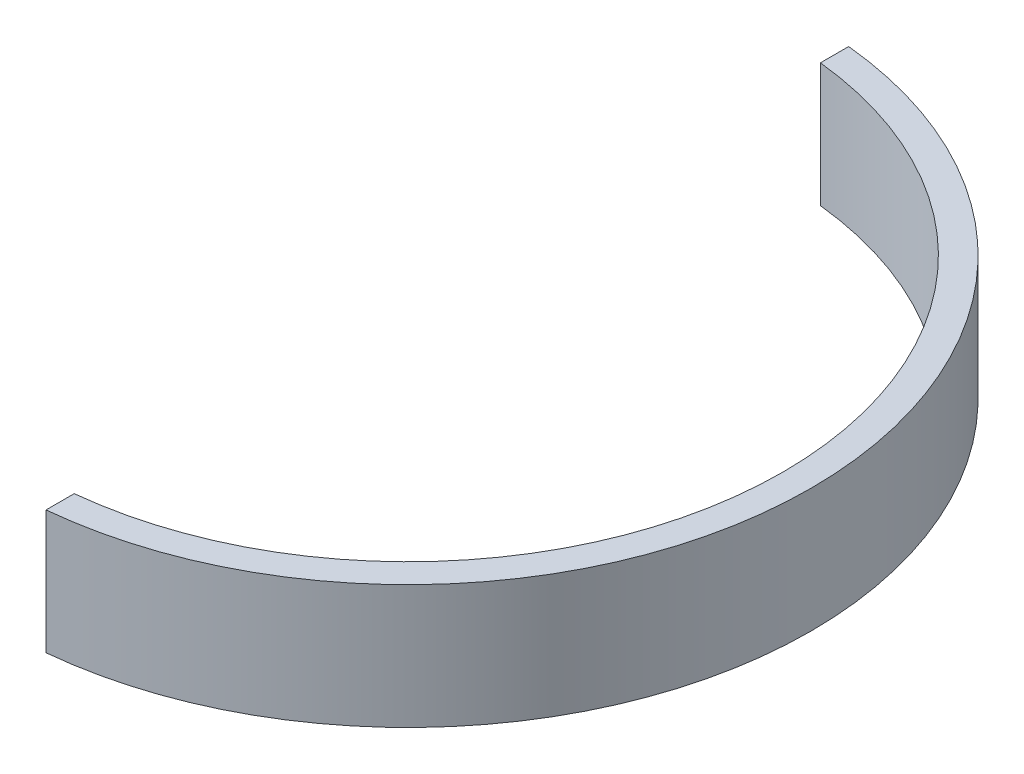
ISO-10303-21;
HEADER;
FILE_DESCRIPTION(('STEP AP214'),'2;1');
FILE_NAME('part.step','',(''),(''),'','','');
FILE_SCHEMA(('AUTOMOTIVE_DESIGN { 1 0 10303 214 1 1 1 1 }'));
ENDSEC;
DATA;
#1=APPLICATION_CONTEXT('core data for automotive mechanical design processes');
#2=APPLICATION_PROTOCOL_DEFINITION('international standard','automotive_design',2000,#1);
#3=PRODUCT_CONTEXT('',#1,'mechanical');
#4=PRODUCT('Part','Part','',(#3));
#5=PRODUCT_RELATED_PRODUCT_CATEGORY('part','',(#4));
#6=PRODUCT_DEFINITION_FORMATION('','',#4);
#7=PRODUCT_DEFINITION_CONTEXT('part definition',#1,'design');
#8=PRODUCT_DEFINITION('design','',#6,#7);
#9=PRODUCT_DEFINITION_SHAPE('','',#8);
#10=(LENGTH_UNIT() NAMED_UNIT(*) SI_UNIT(.MILLI.,.METRE.));
#11=(NAMED_UNIT(*) PLANE_ANGLE_UNIT() SI_UNIT($,.RADIAN.));
#12=(NAMED_UNIT(*) SI_UNIT($,.STERADIAN.) SOLID_ANGLE_UNIT());
#13=UNCERTAINTY_MEASURE_WITH_UNIT(LENGTH_MEASURE(1.E-05),#10,'distance_accuracy_value','');
#14=(GEOMETRIC_REPRESENTATION_CONTEXT(3) GLOBAL_UNCERTAINTY_ASSIGNED_CONTEXT((#13)) GLOBAL_UNIT_ASSIGNED_CONTEXT((#10,
#11,#12)) REPRESENTATION_CONTEXT('',''));
#15=CARTESIAN_POINT('',(0.,0.,0.));
#16=DIRECTION('',(0.,0.,1.));
#17=DIRECTION('',(1.,0.,0.));
#18=AXIS2_PLACEMENT_3D('',#15,#16,#17);
#19=CARTESIAN_POINT('',(0.,22.04,0.));
#20=DIRECTION('',(0.,-1.,0.));
#21=DIRECTION('',(0.,0.,-1.));
#22=AXIS2_PLACEMENT_3D('',#19,#20,#21);
#23=CYLINDRICAL_SURFACE('',#22,66.845);
#24=CARTESIAN_POINT('',(0.,0.,0.));
#25=DIRECTION('',(0.,-1.,0.));
#26=DIRECTION('',(0.,0.,1.));
#27=AXIS2_PLACEMENT_3D('',#24,#25,#26);
#28=CIRCLE('',#27,66.845);
#29=CARTESIAN_POINT('',(7.03599999999999,0.,-66.473669441366));
#30=VERTEX_POINT('',#29);
#31=CARTESIAN_POINT('',(7.03599999999999,0.,66.473669441366));
#32=VERTEX_POINT('',#31);
#33=EDGE_CURVE('E96',#30,#32,#28,.T.);
#34=ORIENTED_EDGE('',*,*,#33,.T.);
#35=DIRECTION('',(0.,-1.,0.));
#36=VECTOR('',#35,1.);
#37=CARTESIAN_POINT('',(7.03599999999999,22.04,66.473669441366));
#38=LINE('',#37,#36);
#39=CARTESIAN_POINT('',(7.03599999999999,22.04,66.473669441366));
#40=VERTEX_POINT('',#39);
#41=EDGE_CURVE('E11',#40,#32,#38,.T.);
#42=ORIENTED_EDGE('',*,*,#41,.F.);
#43=CARTESIAN_POINT('',(0.,22.04,0.));
#44=DIRECTION('',(0.,-1.,0.));
#45=DIRECTION('',(0.,0.,1.));
#46=AXIS2_PLACEMENT_3D('',#43,#44,#45);
#47=CIRCLE('',#46,66.845);
#48=CARTESIAN_POINT('',(7.03599999999999,22.04,-66.473669441366));
#49=VERTEX_POINT('',#48);
#50=EDGE_CURVE('E84',#49,#40,#47,.T.);
#51=ORIENTED_EDGE('',*,*,#50,.F.);
#52=DIRECTION('',(0.,-1.,0.));
#53=VECTOR('',#52,1.);
#54=CARTESIAN_POINT('',(7.03599999999999,22.04,-66.473669441366));
#55=LINE('',#54,#53);
#56=EDGE_CURVE('E92',#49,#30,#55,.T.);
#57=ORIENTED_EDGE('',*,*,#56,.T.);
#58=EDGE_LOOP('',(#34,#42,#51,#57));
#59=FACE_BOUND('',#58,.T.);
#60=ADVANCED_FACE('F33',(#59),#23,.F.);
#61=CARTESIAN_POINT('',(7.03599999999999,22.04,66.473669441366));
#62=DIRECTION('',(1.,0.,0.));
#63=DIRECTION('',(0.,0.,-1.));
#64=AXIS2_PLACEMENT_3D('',#61,#62,#63);
#65=PLANE('',#64);
#66=DIRECTION('',(0.,0.,1.));
#67=VECTOR('',#66,1.);
#68=CARTESIAN_POINT('',(7.03599999999999,0.,66.473669441366));
#69=LINE('',#68,#67);
#70=CARTESIAN_POINT('',(7.03599999999999,0.,71.4996414606395));
#71=VERTEX_POINT('',#70);
#72=EDGE_CURVE('E88',#32,#71,#69,.T.);
#73=ORIENTED_EDGE('',*,*,#72,.T.);
#74=DIRECTION('',(0.,-1.,0.));
#75=VECTOR('',#74,1.);
#76=CARTESIAN_POINT('',(7.03599999999999,22.04,71.4996414606395));
#77=LINE('',#76,#75);
#78=CARTESIAN_POINT('',(7.03599999999999,22.04,71.4996414606395));
#79=VERTEX_POINT('',#78);
#80=EDGE_CURVE('E41',#79,#71,#77,.T.);
#81=ORIENTED_EDGE('',*,*,#80,.F.);
#82=DIRECTION('',(0.,0.,1.));
#83=VECTOR('',#82,1.);
#84=CARTESIAN_POINT('',(7.03599999999999,22.04,66.473669441366));
#85=LINE('',#84,#83);
#86=EDGE_CURVE('E79',#40,#79,#85,.T.);
#87=ORIENTED_EDGE('',*,*,#86,.F.);
#88=ORIENTED_EDGE('',*,*,#41,.T.);
#89=EDGE_LOOP('',(#73,#81,#87,#88));
#90=FACE_BOUND('',#89,.T.);
#91=ADVANCED_FACE('F87',(#90),#65,.F.);
#92=CARTESIAN_POINT('',(0.,22.04,0.));
#93=DIRECTION('',(0.,-1.,0.));
#94=DIRECTION('',(0.,0.,-1.));
#95=AXIS2_PLACEMENT_3D('',#92,#93,#94);
#96=CYLINDRICAL_SURFACE('',#95,71.845);
#97=CARTESIAN_POINT('',(0.,0.,0.));
#98=DIRECTION('',(0.,1.,0.));
#99=DIRECTION('',(0.,0.,1.));
#100=AXIS2_PLACEMENT_3D('',#97,#98,#99);
#101=CIRCLE('',#100,71.845);
#102=CARTESIAN_POINT('',(7.03599999999999,0.,-71.4996414606395));
#103=VERTEX_POINT('',#102);
#104=EDGE_CURVE('E66',#71,#103,#101,.T.);
#105=ORIENTED_EDGE('',*,*,#104,.T.);
#106=DIRECTION('',(0.,-1.,0.));
#107=VECTOR('',#106,1.);
#108=CARTESIAN_POINT('',(7.03599999999999,22.04,-71.4996414606395));
#109=LINE('',#108,#107);
#110=CARTESIAN_POINT('',(7.03599999999999,22.04,-71.4996414606395));
#111=VERTEX_POINT('',#110);
#112=EDGE_CURVE('E89',#111,#103,#109,.T.);
#113=ORIENTED_EDGE('',*,*,#112,.F.);
#114=CARTESIAN_POINT('',(0.,22.04,0.));
#115=DIRECTION('',(0.,1.,0.));
#116=DIRECTION('',(0.,0.,1.));
#117=AXIS2_PLACEMENT_3D('',#114,#115,#116);
#118=CIRCLE('',#117,71.845);
#119=EDGE_CURVE('E82',#79,#111,#118,.T.);
#120=ORIENTED_EDGE('',*,*,#119,.F.);
#121=ORIENTED_EDGE('',*,*,#80,.T.);
#122=EDGE_LOOP('',(#105,#113,#120,#121));
#123=FACE_BOUND('',#122,.T.);
#124=ADVANCED_FACE('F90',(#123),#96,.T.);
#125=CARTESIAN_POINT('',(7.03599999999999,22.04,-66.473669441366));
#126=DIRECTION('',(1.,0.,0.));
#127=DIRECTION('',(0.,0.,-1.));
#128=AXIS2_PLACEMENT_3D('',#125,#126,#127);
#129=PLANE('',#128);
#130=DIRECTION('',(0.,0.,1.));
#131=VECTOR('',#130,1.);
#132=CARTESIAN_POINT('',(7.03599999999999,0.,-66.473669441366));
#133=LINE('',#132,#131);
#134=EDGE_CURVE('E72',#103,#30,#133,.T.);
#135=ORIENTED_EDGE('',*,*,#134,.T.);
#136=ORIENTED_EDGE('',*,*,#56,.F.);
#137=DIRECTION('',(0.,0.,1.));
#138=VECTOR('',#137,1.);
#139=CARTESIAN_POINT('',(7.03599999999999,22.04,-66.473669441366));
#140=LINE('',#139,#138);
#141=EDGE_CURVE('E49',#111,#49,#140,.T.);
#142=ORIENTED_EDGE('',*,*,#141,.F.);
#143=ORIENTED_EDGE('',*,*,#112,.T.);
#144=EDGE_LOOP('',(#135,#136,#142,#143));
#145=FACE_BOUND('',#144,.T.);
#146=ADVANCED_FACE('F103',(#145),#129,.F.);
#147=CARTESIAN_POINT('',(0.,22.04,0.));
#148=DIRECTION('',(0.,1.,0.));
#149=DIRECTION('',(0.,0.,1.));
#150=AXIS2_PLACEMENT_3D('',#147,#148,#149);
#151=PLANE('',#150);
#152=ORIENTED_EDGE('',*,*,#50,.T.);
#153=ORIENTED_EDGE('',*,*,#86,.T.);
#154=ORIENTED_EDGE('',*,*,#119,.T.);
#155=ORIENTED_EDGE('',*,*,#141,.T.);
#156=EDGE_LOOP('',(#152,#153,#154,#155));
#157=FACE_BOUND('',#156,.T.);
#158=ADVANCED_FACE('F80',(#157),#151,.T.);
#159=CARTESIAN_POINT('',(0.,0.,0.));
#160=DIRECTION('',(0.,1.,0.));
#161=DIRECTION('',(0.,0.,1.));
#162=AXIS2_PLACEMENT_3D('',#159,#160,#161);
#163=PLANE('',#162);
#164=ORIENTED_EDGE('',*,*,#33,.F.);
#165=ORIENTED_EDGE('',*,*,#134,.F.);
#166=ORIENTED_EDGE('',*,*,#104,.F.);
#167=ORIENTED_EDGE('',*,*,#72,.F.);
#168=EDGE_LOOP('',(#164,#165,#166,#167));
#169=FACE_BOUND('',#168,.T.);
#170=ADVANCED_FACE('F106',(#169),#163,.F.);
#171=CLOSED_SHELL('',(#60,#91,#124,#146,#158,#170));
#172=MANIFOLD_SOLID_BREP('B2',#171);
#173=ADVANCED_BREP_SHAPE_REPRESENTATION('',(#18,#172),#14);
#174=SHAPE_DEFINITION_REPRESENTATION(#9,#173);
ENDSEC;
END-ISO-10303-21;
